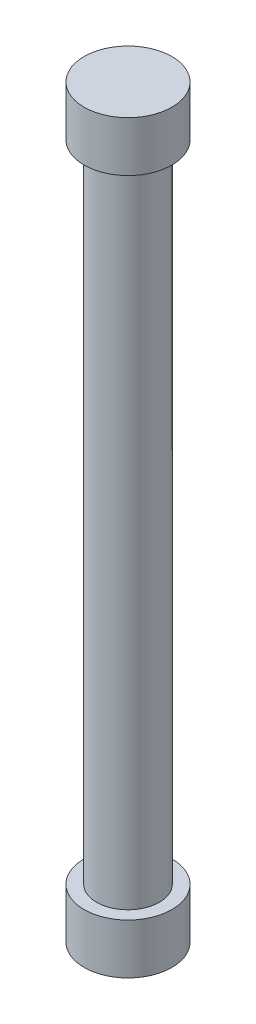
ISO-10303-21;
HEADER;
FILE_DESCRIPTION(('STEP AP214'),'2;1');
FILE_NAME('part.step','',(''),(''),'','','');
FILE_SCHEMA(('AUTOMOTIVE_DESIGN { 1 0 10303 214 1 1 1 1 }'));
ENDSEC;
DATA;
#1=APPLICATION_CONTEXT('core data for automotive mechanical design processes');
#2=APPLICATION_PROTOCOL_DEFINITION('international standard','automotive_design',2000,#1);
#3=PRODUCT_CONTEXT('',#1,'mechanical');
#4=PRODUCT('Part','Part','',(#3));
#5=PRODUCT_RELATED_PRODUCT_CATEGORY('part','',(#4));
#6=PRODUCT_DEFINITION_FORMATION('','',#4);
#7=PRODUCT_DEFINITION_CONTEXT('part definition',#1,'design');
#8=PRODUCT_DEFINITION('design','',#6,#7);
#9=PRODUCT_DEFINITION_SHAPE('','',#8);
#10=(LENGTH_UNIT() NAMED_UNIT(*) SI_UNIT(.MILLI.,.METRE.));
#11=(NAMED_UNIT(*) PLANE_ANGLE_UNIT() SI_UNIT($,.RADIAN.));
#12=(NAMED_UNIT(*) SI_UNIT($,.STERADIAN.) SOLID_ANGLE_UNIT());
#13=UNCERTAINTY_MEASURE_WITH_UNIT(LENGTH_MEASURE(1.E-05),#10,'distance_accuracy_value','');
#14=(GEOMETRIC_REPRESENTATION_CONTEXT(3) GLOBAL_UNCERTAINTY_ASSIGNED_CONTEXT((#13)) GLOBAL_UNIT_ASSIGNED_CONTEXT((#10,
#11,#12)) REPRESENTATION_CONTEXT('',''));
#15=CARTESIAN_POINT('',(0.,0.,0.));
#16=DIRECTION('',(0.,0.,1.));
#17=DIRECTION('',(1.,0.,0.));
#18=AXIS2_PLACEMENT_3D('',#15,#16,#17);
#19=CARTESIAN_POINT('',(0.,51.4,0.));
#20=DIRECTION('',(0.,-1.,0.));
#21=DIRECTION('',(0.,0.,-1.));
#22=AXIS2_PLACEMENT_3D('',#19,#20,#21);
#23=CYLINDRICAL_SURFACE('',#22,2.5);
#24=CARTESIAN_POINT('',(0.,51.4,0.));
#25=DIRECTION('',(0.,1.,0.));
#26=DIRECTION('',(0.,0.,1.));
#27=AXIS2_PLACEMENT_3D('',#24,#25,#26);
#28=CIRCLE('',#27,2.5);
#29=CARTESIAN_POINT('',(0.,51.4,-2.5));
#30=VERTEX_POINT('',#29);
#31=EDGE_CURVE('E10',#30,#30,#28,.T.);
#32=CARTESIAN_POINT('',(0.,0.,0.));
#33=DIRECTION('',(0.,1.,0.));
#34=DIRECTION('',(0.,0.,1.));
#35=AXIS2_PLACEMENT_3D('',#32,#33,#34);
#36=CIRCLE('',#35,2.5);
#37=CARTESIAN_POINT('',(0.,0.,-2.5));
#38=VERTEX_POINT('',#37);
#39=EDGE_CURVE('E46',#38,#38,#36,.T.);
#40=CARTESIAN_POINT('',(0.,51.4,-2.5));
#41=CARTESIAN_POINT('',(0.,50.8645833333333,-2.5));
#42=CARTESIAN_POINT('',(0.,50.3291666666667,-2.5));
#43=CARTESIAN_POINT('',(0.,49.2583333333333,-2.5));
#44=CARTESIAN_POINT('',(0.,48.7229166666667,-2.5));
#45=CARTESIAN_POINT('',(0.,47.6520833333333,-2.5));
#46=CARTESIAN_POINT('',(0.,47.1166666666667,-2.5));
#47=CARTESIAN_POINT('',(0.,46.0458333333333,-2.5));
#48=CARTESIAN_POINT('',(0.,45.5104166666667,-2.5));
#49=CARTESIAN_POINT('',(0.,44.4395833333333,-2.5));
#50=CARTESIAN_POINT('',(0.,43.9041666666667,-2.5));
#51=CARTESIAN_POINT('',(0.,42.8333333333333,-2.5));
#52=CARTESIAN_POINT('',(0.,42.2979166666667,-2.5));
#53=CARTESIAN_POINT('',(0.,41.2270833333333,-2.5));
#54=CARTESIAN_POINT('',(0.,40.6916666666667,-2.5));
#55=CARTESIAN_POINT('',(0.,39.6208333333333,-2.5));
#56=CARTESIAN_POINT('',(0.,39.0854166666667,-2.5));
#57=CARTESIAN_POINT('',(0.,38.0145833333333,-2.5));
#58=CARTESIAN_POINT('',(0.,37.4791666666667,-2.5));
#59=CARTESIAN_POINT('',(0.,36.4083333333333,-2.5));
#60=CARTESIAN_POINT('',(0.,35.8729166666667,-2.5));
#61=CARTESIAN_POINT('',(0.,34.8020833333333,-2.5));
#62=CARTESIAN_POINT('',(0.,34.2666666666667,-2.5));
#63=CARTESIAN_POINT('',(0.,33.1958333333333,-2.5));
#64=CARTESIAN_POINT('',(0.,32.6604166666667,-2.5));
#65=CARTESIAN_POINT('',(0.,31.5895833333333,-2.5));
#66=CARTESIAN_POINT('',(0.,31.0541666666667,-2.5));
#67=CARTESIAN_POINT('',(0.,29.9833333333333,-2.5));
#68=CARTESIAN_POINT('',(0.,29.4479166666667,-2.5));
#69=CARTESIAN_POINT('',(0.,28.3770833333333,-2.5));
#70=CARTESIAN_POINT('',(0.,27.8416666666667,-2.5));
#71=CARTESIAN_POINT('',(0.,26.7708333333333,-2.5));
#72=CARTESIAN_POINT('',(0.,26.2354166666667,-2.5));
#73=CARTESIAN_POINT('',(0.,25.1645833333333,-2.5));
#74=CARTESIAN_POINT('',(0.,24.6291666666667,-2.5));
#75=CARTESIAN_POINT('',(0.,23.5583333333333,-2.5));
#76=CARTESIAN_POINT('',(0.,23.0229166666667,-2.5));
#77=CARTESIAN_POINT('',(0.,21.9520833333333,-2.5));
#78=CARTESIAN_POINT('',(0.,21.4166666666667,-2.5));
#79=CARTESIAN_POINT('',(0.,20.3458333333333,-2.5));
#80=CARTESIAN_POINT('',(0.,19.8104166666667,-2.5));
#81=CARTESIAN_POINT('',(0.,18.7395833333333,-2.5));
#82=CARTESIAN_POINT('',(0.,18.2041666666667,-2.5));
#83=CARTESIAN_POINT('',(0.,17.1333333333333,-2.5));
#84=CARTESIAN_POINT('',(0.,16.5979166666667,-2.5));
#85=CARTESIAN_POINT('',(0.,15.5270833333333,-2.5));
#86=CARTESIAN_POINT('',(0.,14.9916666666667,-2.5));
#87=CARTESIAN_POINT('',(0.,13.9208333333333,-2.5));
#88=CARTESIAN_POINT('',(0.,13.3854166666667,-2.5));
#89=CARTESIAN_POINT('',(0.,12.3145833333333,-2.5));
#90=CARTESIAN_POINT('',(0.,11.7791666666667,-2.5));
#91=CARTESIAN_POINT('',(0.,10.7083333333333,-2.5));
#92=CARTESIAN_POINT('',(0.,10.1729166666667,-2.5));
#93=CARTESIAN_POINT('',(0.,9.10208333333333,-2.5));
#94=CARTESIAN_POINT('',(0.,8.56666666666666,-2.5));
#95=CARTESIAN_POINT('',(0.,7.49583333333333,-2.5));
#96=CARTESIAN_POINT('',(0.,6.96041666666666,-2.5));
#97=CARTESIAN_POINT('',(0.,5.88958333333333,-2.5));
#98=CARTESIAN_POINT('',(0.,5.35416666666666,-2.5));
#99=CARTESIAN_POINT('',(0.,4.28333333333333,-2.5));
#100=CARTESIAN_POINT('',(0.,3.74791666666666,-2.5));
#101=CARTESIAN_POINT('',(0.,2.67708333333333,-2.5));
#102=CARTESIAN_POINT('',(0.,2.14166666666666,-2.5));
#103=CARTESIAN_POINT('',(0.,1.07083333333333,-2.5));
#104=CARTESIAN_POINT('',(0.,0.535416666666661,-2.5));
#105=CARTESIAN_POINT('',(0.,0.,-2.5));
#106=B_SPLINE_CURVE_WITH_KNOTS('',3,(#40,#41,#42,#43,#44,#45,#46,#47,#48,#49,#50,#51,#52,#53,
#54,#55,#56,#57,#58,#59,#60,#61,#62,#63,#64,#65,#66,#67,#68,#69,#70,#71,#72,#73,#74,#75,#76,#77,
#78,#79,#80,#81,#82,#83,#84,#85,#86,#87,#88,#89,#90,#91,#92,#93,#94,#95,#96,#97,#98,#99,#100,
#101,#102,#103,#104,#105),.UNSPECIFIED.,.F.,.F.,(4,2,2,2,2,2,2,2,2,2,2,2,2,2,2,2,2,2,2,2,2,2,2,
2,2,2,2,2,2,2,2,2,4),(0.,1.60625,3.2125,4.81875,6.42499999999999,8.03125,9.6375,11.24375,12.85,
14.45625,16.0625,17.66875,19.275,20.88125,22.4875,24.09375,25.7,27.30625,28.9125,30.51875,
32.125,33.73125,35.3375,36.94375,38.55,40.15625,41.7625,43.36875,44.975,46.58125,48.1875,
49.79375,51.4),.UNSPECIFIED.);
#107=EDGE_CURVE('BSEAM43',#30,#38,#106,.T.);
#108=ORIENTED_EDGE('',*,*,#31,.F.);
#109=ORIENTED_EDGE('',*,*,#39,.T.);
#110=ORIENTED_EDGE('',*,*,#107,.T.);
#111=ORIENTED_EDGE('',*,*,#107,.F.);
#112=EDGE_LOOP('',(#108,#110,#109,#111));
#113=FACE_BOUND('',#112,.T.);
#114=ADVANCED_FACE('F43',(#113),#23,.T.);
#115=CARTESIAN_POINT('',(0.,55.4,0.));
#116=DIRECTION('',(0.,-1.,0.));
#117=DIRECTION('',(0.,0.,-1.));
#118=AXIS2_PLACEMENT_3D('',#115,#116,#117);
#119=CYLINDRICAL_SURFACE('',#118,3.5);
#120=CARTESIAN_POINT('',(0.,55.4,0.));
#121=DIRECTION('',(0.,1.,0.));
#122=DIRECTION('',(0.,0.,1.));
#123=AXIS2_PLACEMENT_3D('',#120,#121,#122);
#124=CIRCLE('',#123,3.5);
#125=CARTESIAN_POINT('',(0.,55.4,3.5));
#126=VERTEX_POINT('',#125);
#127=EDGE_CURVE('E51',#126,#126,#124,.T.);
#128=ORIENTED_EDGE('',*,*,#127,.F.);
#129=EDGE_LOOP('',(#128));
#130=FACE_BOUND('',#129,.T.);
#131=CARTESIAN_POINT('',(0.,51.4,0.));
#132=DIRECTION('',(0.,1.,0.));
#133=DIRECTION('',(0.,0.,1.));
#134=AXIS2_PLACEMENT_3D('',#131,#132,#133);
#135=CIRCLE('',#134,3.5);
#136=CARTESIAN_POINT('',(0.,51.4,3.5));
#137=VERTEX_POINT('',#136);
#138=EDGE_CURVE('E56',#137,#137,#135,.T.);
#139=ORIENTED_EDGE('',*,*,#138,.T.);
#140=EDGE_LOOP('',(#139));
#141=FACE_BOUND('',#140,.T.);
#142=ADVANCED_FACE('F97',(#130,#141),#119,.T.);
#143=CARTESIAN_POINT('',(0.,55.4,0.));
#144=DIRECTION('',(0.,1.,0.));
#145=DIRECTION('',(0.,0.,1.));
#146=AXIS2_PLACEMENT_3D('',#143,#144,#145);
#147=PLANE('',#146);
#148=ORIENTED_EDGE('',*,*,#127,.T.);
#149=EDGE_LOOP('',(#148));
#150=FACE_BOUND('',#149,.T.);
#151=ADVANCED_FACE('F93',(#150),#147,.T.);
#152=CARTESIAN_POINT('',(0.,51.4,0.));
#153=DIRECTION('',(0.,1.,0.));
#154=DIRECTION('',(0.,0.,1.));
#155=AXIS2_PLACEMENT_3D('',#152,#153,#154);
#156=PLANE('',#155);
#157=ORIENTED_EDGE('',*,*,#31,.T.);
#158=EDGE_LOOP('',(#157));
#159=FACE_BOUND('',#158,.T.);
#160=ORIENTED_EDGE('',*,*,#138,.F.);
#161=EDGE_LOOP('',(#160));
#162=FACE_BOUND('',#161,.T.);
#163=ADVANCED_FACE('F85',(#159,#162),#156,.F.);
#164=CARTESIAN_POINT('',(0.,-4.,0.));
#165=DIRECTION('',(0.,1.,0.));
#166=DIRECTION('',(0.,0.,1.));
#167=AXIS2_PLACEMENT_3D('',#164,#165,#166);
#168=CYLINDRICAL_SURFACE('',#167,3.5);
#169=CARTESIAN_POINT('',(0.,-4.,0.));
#170=DIRECTION('',(0.,-1.,0.));
#171=DIRECTION('',(0.,0.,-1.));
#172=AXIS2_PLACEMENT_3D('',#169,#170,#171);
#173=CIRCLE('',#172,3.5);
#174=CARTESIAN_POINT('',(0.,-4.,-3.5));
#175=VERTEX_POINT('',#174);
#176=EDGE_CURVE('E66',#175,#175,#173,.T.);
#177=ORIENTED_EDGE('',*,*,#176,.F.);
#178=EDGE_LOOP('',(#177));
#179=FACE_BOUND('',#178,.T.);
#180=CARTESIAN_POINT('',(0.,0.,0.));
#181=DIRECTION('',(0.,-1.,0.));
#182=DIRECTION('',(0.,0.,-1.));
#183=AXIS2_PLACEMENT_3D('',#180,#181,#182);
#184=CIRCLE('',#183,3.5);
#185=CARTESIAN_POINT('',(0.,0.,-3.5));
#186=VERTEX_POINT('',#185);
#187=EDGE_CURVE('E62',#186,#186,#184,.T.);
#188=ORIENTED_EDGE('',*,*,#187,.T.);
#189=EDGE_LOOP('',(#188));
#190=FACE_BOUND('',#189,.T.);
#191=ADVANCED_FACE('F83',(#179,#190),#168,.T.);
#192=CARTESIAN_POINT('',(0.,-4.,0.));
#193=DIRECTION('',(0.,-1.,0.));
#194=DIRECTION('',(0.,0.,-1.));
#195=AXIS2_PLACEMENT_3D('',#192,#193,#194);
#196=PLANE('',#195);
#197=ORIENTED_EDGE('',*,*,#176,.T.);
#198=EDGE_LOOP('',(#197));
#199=FACE_BOUND('',#198,.T.);
#200=ADVANCED_FACE('F79',(#199),#196,.T.);
#201=CARTESIAN_POINT('',(0.,0.,0.));
#202=DIRECTION('',(0.,-1.,0.));
#203=DIRECTION('',(0.,0.,-1.));
#204=AXIS2_PLACEMENT_3D('',#201,#202,#203);
#205=PLANE('',#204);
#206=ORIENTED_EDGE('',*,*,#39,.F.);
#207=EDGE_LOOP('',(#206));
#208=FACE_BOUND('',#207,.T.);
#209=ORIENTED_EDGE('',*,*,#187,.F.);
#210=EDGE_LOOP('',(#209));
#211=FACE_BOUND('',#210,.T.);
#212=ADVANCED_FACE('F76',(#208,#211),#205,.F.);
#213=CLOSED_SHELL('',(#114,#142,#151,#163,#191,#200,#212));
#214=MANIFOLD_SOLID_BREP('B2',#213);
#215=ADVANCED_BREP_SHAPE_REPRESENTATION('',(#18,#214),#14);
#216=SHAPE_DEFINITION_REPRESENTATION(#9,#215);
ENDSEC;
END-ISO-10303-21;
